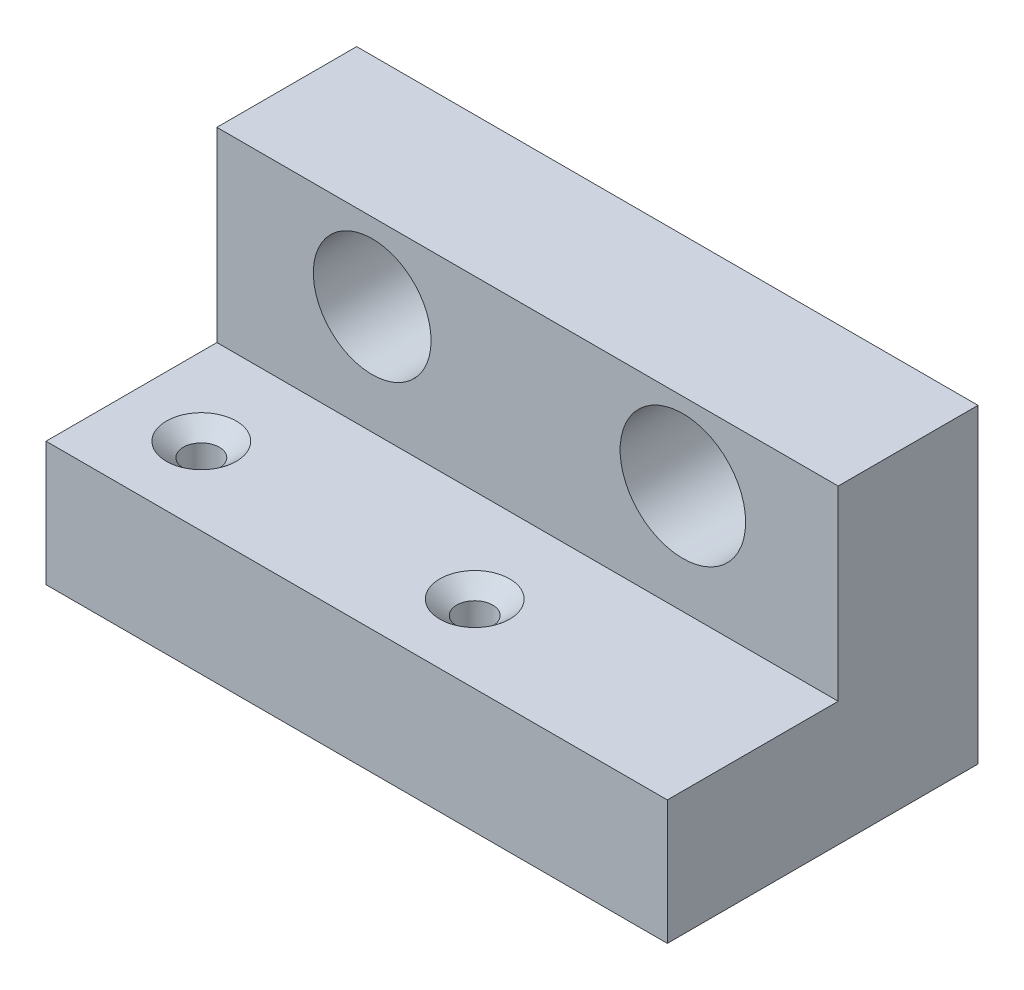
ISO-10303-21;
HEADER;
FILE_DESCRIPTION(('STEP AP214'),'2;1');
FILE_NAME('part.step','',(''),(''),'','','');
FILE_SCHEMA(('AUTOMOTIVE_DESIGN { 1 0 10303 214 1 1 1 1 }'));
ENDSEC;
DATA;
#1=APPLICATION_CONTEXT('core data for automotive mechanical design processes');
#2=APPLICATION_PROTOCOL_DEFINITION('international standard','automotive_design',2000,#1);
#3=PRODUCT_CONTEXT('',#1,'mechanical');
#4=PRODUCT('Part','Part','',(#3));
#5=PRODUCT_RELATED_PRODUCT_CATEGORY('part','',(#4));
#6=PRODUCT_DEFINITION_FORMATION('','',#4);
#7=PRODUCT_DEFINITION_CONTEXT('part definition',#1,'design');
#8=PRODUCT_DEFINITION('design','',#6,#7);
#9=PRODUCT_DEFINITION_SHAPE('','',#8);
#10=(LENGTH_UNIT() NAMED_UNIT(*) SI_UNIT(.MILLI.,.METRE.));
#11=(NAMED_UNIT(*) PLANE_ANGLE_UNIT() SI_UNIT($,.RADIAN.));
#12=(NAMED_UNIT(*) SI_UNIT($,.STERADIAN.) SOLID_ANGLE_UNIT());
#13=UNCERTAINTY_MEASURE_WITH_UNIT(LENGTH_MEASURE(1.E-05),#10,'distance_accuracy_value','');
#14=(GEOMETRIC_REPRESENTATION_CONTEXT(3) GLOBAL_UNCERTAINTY_ASSIGNED_CONTEXT((#13)) GLOBAL_UNIT_ASSIGNED_CONTEXT((#10,
#11,#12)) REPRESENTATION_CONTEXT('',''));
#15=CARTESIAN_POINT('',(0.,0.,0.));
#16=DIRECTION('',(0.,0.,1.));
#17=DIRECTION('',(1.,0.,0.));
#18=AXIS2_PLACEMENT_3D('',#15,#16,#17);
#19=CARTESIAN_POINT('',(0.,0.,11.4300000000001));
#20=DIRECTION('',(0.,0.,1.));
#21=DIRECTION('',(1.,0.,0.));
#22=AXIS2_PLACEMENT_3D('',#19,#20,#21);
#23=PLANE('',#22);
#24=DIRECTION('',(-1.,0.,0.));
#25=VECTOR('',#24,1.);
#26=CARTESIAN_POINT('',(0.,10.1599999999999,11.4300000000001));
#27=LINE('',#26,#25);
#28=CARTESIAN_POINT('',(50.8,10.1599999999999,11.4300000000001));
#29=VERTEX_POINT('',#28);
#30=CARTESIAN_POINT('',(0.,10.1599999999999,11.4300000000001));
#31=VERTEX_POINT('',#30);
#32=EDGE_CURVE('E62',#29,#31,#27,.T.);
#33=ORIENTED_EDGE('',*,*,#32,.F.);
#34=DIRECTION('',(0.,1.,0.));
#35=VECTOR('',#34,1.);
#36=CARTESIAN_POINT('',(50.8,0.,11.4300000000001));
#37=LINE('',#36,#35);
#38=CARTESIAN_POINT('',(50.8,25.4000000000001,11.4300000000001));
#39=VERTEX_POINT('',#38);
#40=EDGE_CURVE('E136',#29,#39,#37,.T.);
#41=ORIENTED_EDGE('',*,*,#40,.T.);
#42=DIRECTION('',(-1.,0.,0.));
#43=VECTOR('',#42,1.);
#44=CARTESIAN_POINT('',(50.8,25.4000000000001,11.4300000000001));
#45=LINE('',#44,#43);
#46=CARTESIAN_POINT('',(0.,25.4000000000001,11.4300000000001));
#47=VERTEX_POINT('',#46);
#48=EDGE_CURVE('E139',#39,#47,#45,.T.);
#49=ORIENTED_EDGE('',*,*,#48,.T.);
#50=DIRECTION('',(0.,-1.,0.));
#51=VECTOR('',#50,1.);
#52=CARTESIAN_POINT('',(0.,25.4000000000001,11.4300000000001));
#53=LINE('',#52,#51);
#54=EDGE_CURVE('E58',#47,#31,#53,.T.);
#55=ORIENTED_EDGE('',*,*,#54,.T.);
#56=EDGE_LOOP('',(#33,#41,#49,#55));
#57=FACE_BOUND('',#56,.T.);
#58=CARTESIAN_POINT('',(12.6999999999999,19.05,11.4300000000001));
#59=DIRECTION('',(0.,0.,1.));
#60=DIRECTION('',(1.,0.,0.));
#61=AXIS2_PLACEMENT_3D('',#58,#59,#60);
#62=CIRCLE('',#61,4.8133);
#63=CARTESIAN_POINT('',(17.5132999999999,19.05,11.4300000000001));
#64=VERTEX_POINT('',#63);
#65=EDGE_CURVE('E129',#64,#64,#62,.T.);
#66=ORIENTED_EDGE('',*,*,#65,.F.);
#67=EDGE_LOOP('',(#66));
#68=FACE_BOUND('',#67,.T.);
#69=CARTESIAN_POINT('',(38.1,19.05,11.4300000000001));
#70=DIRECTION('',(0.,0.,1.));
#71=DIRECTION('',(1.,0.,0.));
#72=AXIS2_PLACEMENT_3D('',#69,#70,#71);
#73=CIRCLE('',#72,5.1308);
#74=CARTESIAN_POINT('',(43.2308,19.05,11.4300000000001));
#75=VERTEX_POINT('',#74);
#76=EDGE_CURVE('E123',#75,#75,#73,.T.);
#77=ORIENTED_EDGE('',*,*,#76,.F.);
#78=EDGE_LOOP('',(#77));
#79=FACE_BOUND('',#78,.T.);
#80=ADVANCED_FACE('F43',(#57,#68,#79),#23,.T.);
#81=CARTESIAN_POINT('',(0.,0.,0.));
#82=DIRECTION('',(0.,0.,1.));
#83=DIRECTION('',(1.,0.,0.));
#84=AXIS2_PLACEMENT_3D('',#81,#82,#83);
#85=PLANE('',#84);
#86=DIRECTION('',(-1.,0.,0.));
#87=VECTOR('',#86,1.);
#88=CARTESIAN_POINT('',(50.8,25.4000000000001,0.));
#89=LINE('',#88,#87);
#90=CARTESIAN_POINT('',(50.8,25.4000000000001,0.));
#91=VERTEX_POINT('',#90);
#92=CARTESIAN_POINT('',(0.,25.4000000000001,0.));
#93=VERTEX_POINT('',#92);
#94=EDGE_CURVE('E137',#91,#93,#89,.T.);
#95=ORIENTED_EDGE('',*,*,#94,.F.);
#96=DIRECTION('',(0.,1.,0.));
#97=VECTOR('',#96,1.);
#98=CARTESIAN_POINT('',(50.8,0.,0.));
#99=LINE('',#98,#97);
#100=CARTESIAN_POINT('',(50.8,0.,0.));
#101=VERTEX_POINT('',#100);
#102=EDGE_CURVE('E145',#101,#91,#99,.T.);
#103=ORIENTED_EDGE('',*,*,#102,.F.);
#104=DIRECTION('',(1.,0.,0.));
#105=VECTOR('',#104,1.);
#106=CARTESIAN_POINT('',(0.,0.,0.));
#107=LINE('',#106,#105);
#108=CARTESIAN_POINT('',(0.,0.,0.));
#109=VERTEX_POINT('',#108);
#110=EDGE_CURVE('E143',#109,#101,#107,.T.);
#111=ORIENTED_EDGE('',*,*,#110,.F.);
#112=DIRECTION('',(0.,-1.,0.));
#113=VECTOR('',#112,1.);
#114=CARTESIAN_POINT('',(0.,25.4000000000001,0.));
#115=LINE('',#114,#113);
#116=EDGE_CURVE('E132',#93,#109,#115,.T.);
#117=ORIENTED_EDGE('',*,*,#116,.F.);
#118=EDGE_LOOP('',(#95,#103,#111,#117));
#119=FACE_BOUND('',#118,.T.);
#120=CARTESIAN_POINT('',(12.6999999999999,19.05,0.));
#121=DIRECTION('',(0.,0.,1.));
#122=DIRECTION('',(1.,0.,0.));
#123=AXIS2_PLACEMENT_3D('',#120,#121,#122);
#124=CIRCLE('',#123,4.8133);
#125=CARTESIAN_POINT('',(17.5132999999999,19.05,0.));
#126=VERTEX_POINT('',#125);
#127=EDGE_CURVE('E126',#126,#126,#124,.T.);
#128=ORIENTED_EDGE('',*,*,#127,.T.);
#129=EDGE_LOOP('',(#128));
#130=FACE_BOUND('',#129,.T.);
#131=CARTESIAN_POINT('',(38.1,19.05,0.));
#132=DIRECTION('',(0.,0.,1.));
#133=DIRECTION('',(1.,0.,0.));
#134=AXIS2_PLACEMENT_3D('',#131,#132,#133);
#135=CIRCLE('',#134,5.1308);
#136=CARTESIAN_POINT('',(43.2308,19.05,0.));
#137=VERTEX_POINT('',#136);
#138=EDGE_CURVE('E122',#137,#137,#135,.T.);
#139=ORIENTED_EDGE('',*,*,#138,.T.);
#140=EDGE_LOOP('',(#139));
#141=FACE_BOUND('',#140,.T.);
#142=ADVANCED_FACE('F161',(#119,#130,#141),#85,.F.);
#143=CARTESIAN_POINT('',(0.,25.4000000000001,11.4300000000001));
#144=DIRECTION('',(1.,0.,0.));
#145=DIRECTION('',(0.,1.,0.));
#146=AXIS2_PLACEMENT_3D('',#143,#144,#145);
#147=PLANE('',#146);
#148=ORIENTED_EDGE('',*,*,#116,.T.);
#149=DIRECTION('',(0.,0.,-1.));
#150=VECTOR('',#149,1.);
#151=CARTESIAN_POINT('',(0.,0.,11.4300000000001));
#152=LINE('',#151,#150);
#153=CARTESIAN_POINT('',(0.,0.,25.4000000000001));
#154=VERTEX_POINT('',#153);
#155=EDGE_CURVE('E11',#154,#109,#152,.T.);
#156=ORIENTED_EDGE('',*,*,#155,.F.);
#157=DIRECTION('',(0.,-1.,0.));
#158=VECTOR('',#157,1.);
#159=CARTESIAN_POINT('',(0.,10.1599999999999,25.4000000000001));
#160=LINE('',#159,#158);
#161=CARTESIAN_POINT('',(0.,10.1599999999999,25.4000000000001));
#162=VERTEX_POINT('',#161);
#163=EDGE_CURVE('E104',#162,#154,#160,.T.);
#164=ORIENTED_EDGE('',*,*,#163,.F.);
#165=DIRECTION('',(0.,0.,1.));
#166=VECTOR('',#165,1.);
#167=CARTESIAN_POINT('',(0.,10.1599999999999,0.));
#168=LINE('',#167,#166);
#169=EDGE_CURVE('E93',#31,#162,#168,.T.);
#170=ORIENTED_EDGE('',*,*,#169,.F.);
#171=ORIENTED_EDGE('',*,*,#54,.F.);
#172=DIRECTION('',(0.,0.,-1.));
#173=VECTOR('',#172,1.);
#174=CARTESIAN_POINT('',(0.,25.4000000000001,11.4300000000001));
#175=LINE('',#174,#173);
#176=EDGE_CURVE('E141',#47,#93,#175,.T.);
#177=ORIENTED_EDGE('',*,*,#176,.T.);
#178=EDGE_LOOP('',(#148,#156,#164,#170,#171,#177));
#179=FACE_BOUND('',#178,.T.);
#180=ADVANCED_FACE('F45',(#179),#147,.F.);
#181=CARTESIAN_POINT('',(0.,0.,11.4300000000001));
#182=DIRECTION('',(0.,1.,0.));
#183=DIRECTION('',(0.,0.,1.));
#184=AXIS2_PLACEMENT_3D('',#181,#182,#183);
#185=PLANE('',#184);
#186=CARTESIAN_POINT('',(6.35000000000008,0.,19.05));
#187=DIRECTION('',(0.,1.,0.));
#188=DIRECTION('',(0.,0.,1.));
#189=AXIS2_PLACEMENT_3D('',#186,#187,#188);
#190=CIRCLE('',#189,1.4732);
#191=CARTESIAN_POINT('',(6.35000000000008,0.,20.5232));
#192=VERTEX_POINT('',#191);
#193=EDGE_CURVE('E200',#192,#192,#190,.T.);
#194=ORIENTED_EDGE('',*,*,#193,.T.);
#195=EDGE_LOOP('',(#194));
#196=FACE_BOUND('',#195,.T.);
#197=CARTESIAN_POINT('',(28.702,0.,19.05));
#198=DIRECTION('',(0.,1.,0.));
#199=DIRECTION('',(0.,0.,1.));
#200=AXIS2_PLACEMENT_3D('',#197,#198,#199);
#201=CIRCLE('',#200,1.4732);
#202=CARTESIAN_POINT('',(28.702,0.,20.5232));
#203=VERTEX_POINT('',#202);
#204=EDGE_CURVE('E119',#203,#203,#201,.T.);
#205=ORIENTED_EDGE('',*,*,#204,.T.);
#206=EDGE_LOOP('',(#205));
#207=FACE_BOUND('',#206,.T.);
#208=ORIENTED_EDGE('',*,*,#110,.T.);
#209=DIRECTION('',(0.,0.,-1.));
#210=VECTOR('',#209,1.);
#211=CARTESIAN_POINT('',(50.8,0.,11.4300000000001));
#212=LINE('',#211,#210);
#213=CARTESIAN_POINT('',(50.8,0.,25.4000000000001));
#214=VERTEX_POINT('',#213);
#215=EDGE_CURVE('E51',#214,#101,#212,.T.);
#216=ORIENTED_EDGE('',*,*,#215,.F.);
#217=DIRECTION('',(1.,0.,0.));
#218=VECTOR('',#217,1.);
#219=CARTESIAN_POINT('',(0.,0.,25.4000000000001));
#220=LINE('',#219,#218);
#221=EDGE_CURVE('E101',#154,#214,#220,.T.);
#222=ORIENTED_EDGE('',*,*,#221,.F.);
#223=ORIENTED_EDGE('',*,*,#155,.T.);
#224=EDGE_LOOP('',(#208,#216,#222,#223));
#225=FACE_BOUND('',#224,.T.);
#226=ADVANCED_FACE('F187',(#196,#207,#225),#185,.F.);
#227=CARTESIAN_POINT('',(50.8,0.,11.4300000000001));
#228=DIRECTION('',(-1.,0.,0.));
#229=DIRECTION('',(0.,0.,1.));
#230=AXIS2_PLACEMENT_3D('',#227,#228,#229);
#231=PLANE('',#230);
#232=ORIENTED_EDGE('',*,*,#40,.F.);
#233=DIRECTION('',(0.,0.,-1.));
#234=VECTOR('',#233,1.);
#235=CARTESIAN_POINT('',(50.8,10.1599999999999,25.4000000000001));
#236=LINE('',#235,#234);
#237=CARTESIAN_POINT('',(50.8,10.1599999999999,25.4000000000001));
#238=VERTEX_POINT('',#237);
#239=EDGE_CURVE('E113',#238,#29,#236,.T.);
#240=ORIENTED_EDGE('',*,*,#239,.F.);
#241=DIRECTION('',(0.,-1.,0.));
#242=VECTOR('',#241,1.);
#243=CARTESIAN_POINT('',(50.8,10.1599999999999,25.4000000000001));
#244=LINE('',#243,#242);
#245=EDGE_CURVE('E108',#238,#214,#244,.T.);
#246=ORIENTED_EDGE('',*,*,#245,.T.);
#247=ORIENTED_EDGE('',*,*,#215,.T.);
#248=ORIENTED_EDGE('',*,*,#102,.T.);
#249=DIRECTION('',(0.,0.,-1.));
#250=VECTOR('',#249,1.);
#251=CARTESIAN_POINT('',(50.8,25.4000000000001,11.4300000000001));
#252=LINE('',#251,#250);
#253=EDGE_CURVE('E150',#39,#91,#252,.T.);
#254=ORIENTED_EDGE('',*,*,#253,.F.);
#255=EDGE_LOOP('',(#232,#240,#246,#247,#248,#254));
#256=FACE_BOUND('',#255,.T.);
#257=ADVANCED_FACE('F155',(#256),#231,.F.);
#258=CARTESIAN_POINT('',(50.8,25.4000000000001,11.4300000000001));
#259=DIRECTION('',(0.,-1.,0.));
#260=DIRECTION('',(1.,0.,0.));
#261=AXIS2_PLACEMENT_3D('',#258,#259,#260);
#262=PLANE('',#261);
#263=ORIENTED_EDGE('',*,*,#94,.T.);
#264=ORIENTED_EDGE('',*,*,#176,.F.);
#265=ORIENTED_EDGE('',*,*,#48,.F.);
#266=ORIENTED_EDGE('',*,*,#253,.T.);
#267=EDGE_LOOP('',(#263,#264,#265,#266));
#268=FACE_BOUND('',#267,.T.);
#269=ADVANCED_FACE('F166',(#268),#262,.F.);
#270=CARTESIAN_POINT('',(12.6999999999999,19.05,11.4300000000001));
#271=DIRECTION('',(0.,0.,-1.));
#272=DIRECTION('',(-1.,0.,0.));
#273=AXIS2_PLACEMENT_3D('',#270,#271,#272);
#274=CYLINDRICAL_SURFACE('',#273,4.8133);
#275=ORIENTED_EDGE('',*,*,#65,.T.);
#276=EDGE_LOOP('',(#275));
#277=FACE_BOUND('',#276,.T.);
#278=ORIENTED_EDGE('',*,*,#127,.F.);
#279=EDGE_LOOP('',(#278));
#280=FACE_BOUND('',#279,.T.);
#281=ADVANCED_FACE('F178',(#277,#280),#274,.F.);
#282=CARTESIAN_POINT('',(38.1,19.05,11.4300000000001));
#283=DIRECTION('',(0.,0.,-1.));
#284=DIRECTION('',(-1.,0.,0.));
#285=AXIS2_PLACEMENT_3D('',#282,#283,#284);
#286=CYLINDRICAL_SURFACE('',#285,5.1308);
#287=ORIENTED_EDGE('',*,*,#76,.T.);
#288=EDGE_LOOP('',(#287));
#289=FACE_BOUND('',#288,.T.);
#290=ORIENTED_EDGE('',*,*,#138,.F.);
#291=EDGE_LOOP('',(#290));
#292=FACE_BOUND('',#291,.T.);
#293=ADVANCED_FACE('F175',(#289,#292),#286,.F.);
#294=CARTESIAN_POINT('',(0.,10.1599999999999,25.4000000000001));
#295=DIRECTION('',(0.,0.,-1.));
#296=DIRECTION('',(-1.,0.,0.));
#297=AXIS2_PLACEMENT_3D('',#294,#295,#296);
#298=PLANE('',#297);
#299=ORIENTED_EDGE('',*,*,#221,.T.);
#300=ORIENTED_EDGE('',*,*,#245,.F.);
#301=DIRECTION('',(1.,0.,0.));
#302=VECTOR('',#301,1.);
#303=CARTESIAN_POINT('',(0.,10.1599999999999,25.4000000000001));
#304=LINE('',#303,#302);
#305=EDGE_CURVE('E98',#162,#238,#304,.T.);
#306=ORIENTED_EDGE('',*,*,#305,.F.);
#307=ORIENTED_EDGE('',*,*,#163,.T.);
#308=EDGE_LOOP('',(#299,#300,#306,#307));
#309=FACE_BOUND('',#308,.T.);
#310=ADVANCED_FACE('F110',(#309),#298,.F.);
#311=CARTESIAN_POINT('',(0.,10.1599999999999,0.));
#312=DIRECTION('',(0.,1.,0.));
#313=DIRECTION('',(0.,0.,1.));
#314=AXIS2_PLACEMENT_3D('',#311,#312,#313);
#315=PLANE('',#314);
#316=CARTESIAN_POINT('',(6.35000000000008,10.1599999999999,19.05));
#317=DIRECTION('',(0.,1.,0.));
#318=DIRECTION('',(0.,0.,1.));
#319=AXIS2_PLACEMENT_3D('',#316,#317,#318);
#320=CIRCLE('',#319,2.8575);
#321=CARTESIAN_POINT('',(6.35000000000008,10.1599999999999,21.9075));
#322=VERTEX_POINT('',#321);
#323=EDGE_CURVE('E215',#322,#322,#320,.T.);
#324=ORIENTED_EDGE('',*,*,#323,.F.);
#325=EDGE_LOOP('',(#324));
#326=FACE_BOUND('',#325,.T.);
#327=CARTESIAN_POINT('',(28.702,10.1599999999999,19.05));
#328=DIRECTION('',(0.,1.,0.));
#329=DIRECTION('',(0.,0.,1.));
#330=AXIS2_PLACEMENT_3D('',#327,#328,#329);
#331=CIRCLE('',#330,2.8575);
#332=CARTESIAN_POINT('',(28.702,10.1599999999999,21.9075));
#333=VERTEX_POINT('',#332);
#334=EDGE_CURVE('E206',#333,#333,#331,.T.);
#335=ORIENTED_EDGE('',*,*,#334,.F.);
#336=EDGE_LOOP('',(#335));
#337=FACE_BOUND('',#336,.T.);
#338=ORIENTED_EDGE('',*,*,#239,.T.);
#339=ORIENTED_EDGE('',*,*,#32,.T.);
#340=ORIENTED_EDGE('',*,*,#169,.T.);
#341=ORIENTED_EDGE('',*,*,#305,.T.);
#342=EDGE_LOOP('',(#338,#339,#340,#341));
#343=FACE_BOUND('',#342,.T.);
#344=ADVANCED_FACE('F96',(#326,#337,#343),#315,.T.);
#345=CARTESIAN_POINT('',(28.702,10.1599999999999,19.05));
#346=DIRECTION('',(0.,1.,0.));
#347=DIRECTION('',(0.,0.,1.));
#348=AXIS2_PLACEMENT_3D('',#345,#346,#347);
#349=CYLINDRICAL_SURFACE('',#348,1.4732);
#350=ORIENTED_EDGE('',*,*,#204,.F.);
#351=EDGE_LOOP('',(#350));
#352=FACE_BOUND('',#351,.T.);
#353=CARTESIAN_POINT('',(28.702,8.99843438056136,19.05));
#354=DIRECTION('',(0.,1.,0.));
#355=DIRECTION('',(0.,0.,1.));
#356=AXIS2_PLACEMENT_3D('',#353,#354,#355);
#357=CIRCLE('',#356,1.4732);
#358=CARTESIAN_POINT('',(28.702,8.99843438056136,20.5232));
#359=VERTEX_POINT('',#358);
#360=EDGE_CURVE('E204',#359,#359,#357,.T.);
#361=ORIENTED_EDGE('',*,*,#360,.T.);
#362=EDGE_LOOP('',(#361));
#363=FACE_BOUND('',#362,.T.);
#364=ADVANCED_FACE('F223',(#352,#363),#349,.F.);
#365=CARTESIAN_POINT('',(28.702,10.1599999999999,19.05));
#366=DIRECTION('',(0.,1.,0.));
#367=DIRECTION('',(0.,0.,1.));
#368=AXIS2_PLACEMENT_3D('',#365,#366,#367);
#369=CONICAL_SURFACE('',#368,2.8575,0.872664625997165);
#370=ORIENTED_EDGE('',*,*,#360,.F.);
#371=EDGE_LOOP('',(#370));
#372=FACE_BOUND('',#371,.T.);
#373=ORIENTED_EDGE('',*,*,#334,.T.);
#374=EDGE_LOOP('',(#373));
#375=FACE_BOUND('',#374,.T.);
#376=ADVANCED_FACE('F227',(#372,#375),#369,.F.);
#377=CARTESIAN_POINT('',(6.35000000000008,10.1599999999999,19.05));
#378=DIRECTION('',(0.,1.,0.));
#379=DIRECTION('',(0.,0.,1.));
#380=AXIS2_PLACEMENT_3D('',#377,#378,#379);
#381=CYLINDRICAL_SURFACE('',#380,1.4732);
#382=ORIENTED_EDGE('',*,*,#193,.F.);
#383=EDGE_LOOP('',(#382));
#384=FACE_BOUND('',#383,.T.);
#385=CARTESIAN_POINT('',(6.35000000000008,8.99843438056136,19.05));
#386=DIRECTION('',(0.,1.,0.));
#387=DIRECTION('',(0.,0.,1.));
#388=AXIS2_PLACEMENT_3D('',#385,#386,#387);
#389=CIRCLE('',#388,1.4732);
#390=CARTESIAN_POINT('',(6.35000000000008,8.99843438056136,20.5232));
#391=VERTEX_POINT('',#390);
#392=EDGE_CURVE('E212',#391,#391,#389,.T.);
#393=ORIENTED_EDGE('',*,*,#392,.T.);
#394=EDGE_LOOP('',(#393));
#395=FACE_BOUND('',#394,.T.);
#396=ADVANCED_FACE('F229',(#384,#395),#381,.F.);
#397=CARTESIAN_POINT('',(6.35000000000008,10.1599999999999,19.05));
#398=DIRECTION('',(0.,1.,0.));
#399=DIRECTION('',(0.,0.,1.));
#400=AXIS2_PLACEMENT_3D('',#397,#398,#399);
#401=CONICAL_SURFACE('',#400,2.8575,0.872664625997164);
#402=ORIENTED_EDGE('',*,*,#392,.F.);
#403=EDGE_LOOP('',(#402));
#404=FACE_BOUND('',#403,.T.);
#405=ORIENTED_EDGE('',*,*,#323,.T.);
#406=EDGE_LOOP('',(#405));
#407=FACE_BOUND('',#406,.T.);
#408=ADVANCED_FACE('F219',(#404,#407),#401,.F.);
#409=CLOSED_SHELL('',(#80,#142,#180,#226,#257,#269,#281,#293,#310,#344,#364,#376,#396,#408));
#410=MANIFOLD_SOLID_BREP('B2',#409);
#411=ADVANCED_BREP_SHAPE_REPRESENTATION('',(#18,#410),#14);
#412=SHAPE_DEFINITION_REPRESENTATION(#9,#411);
ENDSEC;
END-ISO-10303-21;
